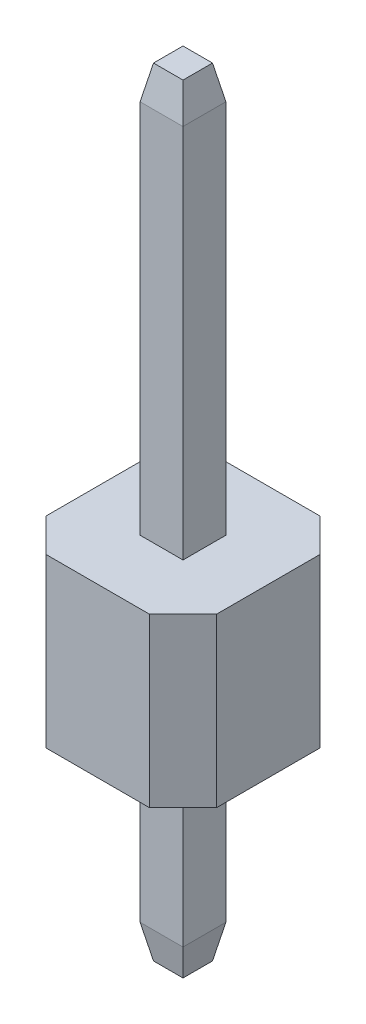
ISO-10303-21;
HEADER;
FILE_DESCRIPTION(('STEP AP214'),'2;1');
FILE_NAME('part.step','',(''),(''),'','','');
FILE_SCHEMA(('AUTOMOTIVE_DESIGN { 1 0 10303 214 1 1 1 1 }'));
ENDSEC;
DATA;
#1=APPLICATION_CONTEXT('core data for automotive mechanical design processes');
#2=APPLICATION_PROTOCOL_DEFINITION('international standard','automotive_design',2000,#1);
#3=PRODUCT_CONTEXT('',#1,'mechanical');
#4=PRODUCT('Part','Part','',(#3));
#5=PRODUCT_RELATED_PRODUCT_CATEGORY('part','',(#4));
#6=PRODUCT_DEFINITION_FORMATION('','',#4);
#7=PRODUCT_DEFINITION_CONTEXT('part definition',#1,'design');
#8=PRODUCT_DEFINITION('design','',#6,#7);
#9=PRODUCT_DEFINITION_SHAPE('','',#8);
#10=(LENGTH_UNIT() NAMED_UNIT(*) SI_UNIT(.MILLI.,.METRE.));
#11=(NAMED_UNIT(*) PLANE_ANGLE_UNIT() SI_UNIT($,.RADIAN.));
#12=(NAMED_UNIT(*) SI_UNIT($,.STERADIAN.) SOLID_ANGLE_UNIT());
#13=UNCERTAINTY_MEASURE_WITH_UNIT(LENGTH_MEASURE(1.E-05),#10,'distance_accuracy_value','');
#14=(GEOMETRIC_REPRESENTATION_CONTEXT(3) GLOBAL_UNCERTAINTY_ASSIGNED_CONTEXT((#13)) GLOBAL_UNIT_ASSIGNED_CONTEXT((#10,
#11,#12)) REPRESENTATION_CONTEXT('',''));
#15=CARTESIAN_POINT('',(0.,0.,0.));
#16=DIRECTION('',(0.,0.,1.));
#17=DIRECTION('',(1.,0.,0.));
#18=AXIS2_PLACEMENT_3D('',#15,#16,#17);
#19=CARTESIAN_POINT('',(-0.770000000000001,2.5,-1.27));
#20=DIRECTION('',(0.,0.,1.));
#21=DIRECTION('',(1.,0.,0.));
#22=AXIS2_PLACEMENT_3D('',#19,#20,#21);
#23=PLANE('',#22);
#24=DIRECTION('',(-1.,0.,0.));
#25=VECTOR('',#24,1.);
#26=CARTESIAN_POINT('',(-0.770000000000001,0.,-1.27));
#27=LINE('',#26,#25);
#28=CARTESIAN_POINT('',(0.769999999999999,0.,-1.27));
#29=VERTEX_POINT('',#28);
#30=CARTESIAN_POINT('',(-0.770000000000001,0.,-1.27));
#31=VERTEX_POINT('',#30);
#32=EDGE_CURVE('E155',#29,#31,#27,.T.);
#33=ORIENTED_EDGE('',*,*,#32,.T.);
#34=DIRECTION('',(0.,-1.,0.));
#35=VECTOR('',#34,1.);
#36=CARTESIAN_POINT('',(-0.770000000000001,2.5,-1.27));
#37=LINE('',#36,#35);
#38=CARTESIAN_POINT('',(-0.770000000000001,2.5,-1.27));
#39=VERTEX_POINT('',#38);
#40=EDGE_CURVE('E12',#39,#31,#37,.T.);
#41=ORIENTED_EDGE('',*,*,#40,.F.);
#42=DIRECTION('',(-1.,0.,0.));
#43=VECTOR('',#42,1.);
#44=CARTESIAN_POINT('',(-0.770000000000001,2.5,-1.27));
#45=LINE('',#44,#43);
#46=CARTESIAN_POINT('',(0.769999999999999,2.5,-1.27));
#47=VERTEX_POINT('',#46);
#48=EDGE_CURVE('E177',#47,#39,#45,.T.);
#49=ORIENTED_EDGE('',*,*,#48,.F.);
#50=DIRECTION('',(0.,-1.,0.));
#51=VECTOR('',#50,1.);
#52=CARTESIAN_POINT('',(0.769999999999999,2.5,-1.27));
#53=LINE('',#52,#51);
#54=EDGE_CURVE('E151',#47,#29,#53,.T.);
#55=ORIENTED_EDGE('',*,*,#54,.T.);
#56=EDGE_LOOP('',(#33,#41,#49,#55));
#57=FACE_BOUND('',#56,.T.);
#58=ADVANCED_FACE('F52',(#57),#23,.F.);
#59=CARTESIAN_POINT('',(-1.27,2.5,-0.769999999999999));
#60=DIRECTION('',(0.707106781186548,0.,0.707106781186548));
#61=DIRECTION('',(0.707106781186548,0.,-0.707106781186548));
#62=AXIS2_PLACEMENT_3D('',#59,#60,#61);
#63=PLANE('',#62);
#64=DIRECTION('',(-0.707106781186548,0.,0.707106781186548));
#65=VECTOR('',#64,1.);
#66=CARTESIAN_POINT('',(-1.27,0.,-0.769999999999999));
#67=LINE('',#66,#65);
#68=CARTESIAN_POINT('',(-1.27,0.,-0.769999999999999));
#69=VERTEX_POINT('',#68);
#70=EDGE_CURVE('E159',#31,#69,#67,.T.);
#71=ORIENTED_EDGE('',*,*,#70,.T.);
#72=DIRECTION('',(0.,-1.,0.));
#73=VECTOR('',#72,1.);
#74=CARTESIAN_POINT('',(-1.27,2.5,-0.769999999999999));
#75=LINE('',#74,#73);
#76=CARTESIAN_POINT('',(-1.27,2.5,-0.769999999999999));
#77=VERTEX_POINT('',#76);
#78=EDGE_CURVE('E61',#77,#69,#75,.T.);
#79=ORIENTED_EDGE('',*,*,#78,.F.);
#80=DIRECTION('',(-0.707106781186548,0.,0.707106781186548));
#81=VECTOR('',#80,1.);
#82=CARTESIAN_POINT('',(-1.27,2.5,-0.769999999999999));
#83=LINE('',#82,#81);
#84=EDGE_CURVE('E112',#39,#77,#83,.T.);
#85=ORIENTED_EDGE('',*,*,#84,.F.);
#86=ORIENTED_EDGE('',*,*,#40,.T.);
#87=EDGE_LOOP('',(#71,#79,#85,#86));
#88=FACE_BOUND('',#87,.T.);
#89=ADVANCED_FACE('F221',(#88),#63,.F.);
#90=CARTESIAN_POINT('',(-1.27,2.5,-0.769999999999999));
#91=DIRECTION('',(1.,0.,0.));
#92=DIRECTION('',(0.,0.,-1.));
#93=AXIS2_PLACEMENT_3D('',#90,#91,#92);
#94=PLANE('',#93);
#95=DIRECTION('',(0.,0.,1.));
#96=VECTOR('',#95,1.);
#97=CARTESIAN_POINT('',(-1.27,0.,-0.769999999999999));
#98=LINE('',#97,#96);
#99=CARTESIAN_POINT('',(-1.27,0.,0.770000000000001));
#100=VERTEX_POINT('',#99);
#101=EDGE_CURVE('E162',#69,#100,#98,.T.);
#102=ORIENTED_EDGE('',*,*,#101,.T.);
#103=DIRECTION('',(0.,-1.,0.));
#104=VECTOR('',#103,1.);
#105=CARTESIAN_POINT('',(-1.27,2.5,0.770000000000001));
#106=LINE('',#105,#104);
#107=CARTESIAN_POINT('',(-1.27,2.5,0.770000000000001));
#108=VERTEX_POINT('',#107);
#109=EDGE_CURVE('E188',#108,#100,#106,.T.);
#110=ORIENTED_EDGE('',*,*,#109,.F.);
#111=DIRECTION('',(0.,0.,1.));
#112=VECTOR('',#111,1.);
#113=CARTESIAN_POINT('',(-1.27,2.5,-0.769999999999999));
#114=LINE('',#113,#112);
#115=EDGE_CURVE('E198',#77,#108,#114,.T.);
#116=ORIENTED_EDGE('',*,*,#115,.F.);
#117=ORIENTED_EDGE('',*,*,#78,.T.);
#118=EDGE_LOOP('',(#102,#110,#116,#117));
#119=FACE_BOUND('',#118,.T.);
#120=ADVANCED_FACE('F196',(#119),#94,.F.);
#121=CARTESIAN_POINT('',(-1.27,2.5,0.770000000000001));
#122=DIRECTION('',(0.707106781186548,0.,-0.707106781186548));
#123=DIRECTION('',(-0.707106781186548,0.,-0.707106781186548));
#124=AXIS2_PLACEMENT_3D('',#121,#122,#123);
#125=PLANE('',#124);
#126=DIRECTION('',(0.707106781186548,0.,0.707106781186548));
#127=VECTOR('',#126,1.);
#128=CARTESIAN_POINT('',(-1.27,0.,0.770000000000001));
#129=LINE('',#128,#127);
#130=CARTESIAN_POINT('',(-0.77,0.,1.27));
#131=VERTEX_POINT('',#130);
#132=EDGE_CURVE('E165',#100,#131,#129,.T.);
#133=ORIENTED_EDGE('',*,*,#132,.T.);
#134=DIRECTION('',(0.,-1.,0.));
#135=VECTOR('',#134,1.);
#136=CARTESIAN_POINT('',(-0.77,2.5,1.27));
#137=LINE('',#136,#135);
#138=CARTESIAN_POINT('',(-0.77,2.5,1.27));
#139=VERTEX_POINT('',#138);
#140=EDGE_CURVE('E184',#139,#131,#137,.T.);
#141=ORIENTED_EDGE('',*,*,#140,.F.);
#142=DIRECTION('',(0.707106781186548,0.,0.707106781186548));
#143=VECTOR('',#142,1.);
#144=CARTESIAN_POINT('',(-1.27,2.5,0.770000000000001));
#145=LINE('',#144,#143);
#146=EDGE_CURVE('E211',#108,#139,#145,.T.);
#147=ORIENTED_EDGE('',*,*,#146,.F.);
#148=ORIENTED_EDGE('',*,*,#109,.T.);
#149=EDGE_LOOP('',(#133,#141,#147,#148));
#150=FACE_BOUND('',#149,.T.);
#151=ADVANCED_FACE('F206',(#150),#125,.F.);
#152=CARTESIAN_POINT('',(-0.77,2.5,1.27));
#153=DIRECTION('',(0.,0.,-1.));
#154=DIRECTION('',(-1.,0.,0.));
#155=AXIS2_PLACEMENT_3D('',#152,#153,#154);
#156=PLANE('',#155);
#157=DIRECTION('',(1.,0.,0.));
#158=VECTOR('',#157,1.);
#159=CARTESIAN_POINT('',(-0.77,0.,1.27));
#160=LINE('',#159,#158);
#161=CARTESIAN_POINT('',(0.77,0.,1.27));
#162=VERTEX_POINT('',#161);
#163=EDGE_CURVE('E168',#131,#162,#160,.T.);
#164=ORIENTED_EDGE('',*,*,#163,.T.);
#165=DIRECTION('',(0.,-1.,0.));
#166=VECTOR('',#165,1.);
#167=CARTESIAN_POINT('',(0.77,2.5,1.27));
#168=LINE('',#167,#166);
#169=CARTESIAN_POINT('',(0.77,2.5,1.27));
#170=VERTEX_POINT('',#169);
#171=EDGE_CURVE('E142',#170,#162,#168,.T.);
#172=ORIENTED_EDGE('',*,*,#171,.F.);
#173=DIRECTION('',(1.,0.,0.));
#174=VECTOR('',#173,1.);
#175=CARTESIAN_POINT('',(-0.77,2.5,1.27));
#176=LINE('',#175,#174);
#177=EDGE_CURVE('E131',#139,#170,#176,.T.);
#178=ORIENTED_EDGE('',*,*,#177,.F.);
#179=ORIENTED_EDGE('',*,*,#140,.T.);
#180=EDGE_LOOP('',(#164,#172,#178,#179));
#181=FACE_BOUND('',#180,.T.);
#182=ADVANCED_FACE('F209',(#181),#156,.F.);
#183=CARTESIAN_POINT('',(0.77,2.5,1.27));
#184=DIRECTION('',(-0.707106781186548,0.,-0.707106781186548));
#185=DIRECTION('',(-0.707106781186548,0.,0.707106781186548));
#186=AXIS2_PLACEMENT_3D('',#183,#184,#185);
#187=PLANE('',#186);
#188=DIRECTION('',(0.707106781186548,0.,-0.707106781186548));
#189=VECTOR('',#188,1.);
#190=CARTESIAN_POINT('',(0.77,0.,1.27));
#191=LINE('',#190,#189);
#192=CARTESIAN_POINT('',(1.27,0.,0.770000000000001));
#193=VERTEX_POINT('',#192);
#194=EDGE_CURVE('E140',#162,#193,#191,.T.);
#195=ORIENTED_EDGE('',*,*,#194,.T.);
#196=DIRECTION('',(0.,-1.,0.));
#197=VECTOR('',#196,1.);
#198=CARTESIAN_POINT('',(1.27,2.5,0.770000000000001));
#199=LINE('',#198,#197);
#200=CARTESIAN_POINT('',(1.27,2.5,0.770000000000001));
#201=VERTEX_POINT('',#200);
#202=EDGE_CURVE('E137',#201,#193,#199,.T.);
#203=ORIENTED_EDGE('',*,*,#202,.F.);
#204=DIRECTION('',(0.707106781186548,0.,-0.707106781186548));
#205=VECTOR('',#204,1.);
#206=CARTESIAN_POINT('',(0.77,2.5,1.27));
#207=LINE('',#206,#205);
#208=EDGE_CURVE('E125',#170,#201,#207,.T.);
#209=ORIENTED_EDGE('',*,*,#208,.F.);
#210=ORIENTED_EDGE('',*,*,#171,.T.);
#211=EDGE_LOOP('',(#195,#203,#209,#210));
#212=FACE_BOUND('',#211,.T.);
#213=ADVANCED_FACE('F138',(#212),#187,.F.);
#214=CARTESIAN_POINT('',(1.27,2.5,-0.769999999999999));
#215=DIRECTION('',(-1.,0.,0.));
#216=DIRECTION('',(0.,0.,1.));
#217=AXIS2_PLACEMENT_3D('',#214,#215,#216);
#218=PLANE('',#217);
#219=DIRECTION('',(0.,0.,-1.));
#220=VECTOR('',#219,1.);
#221=CARTESIAN_POINT('',(1.27,0.,-0.769999999999999));
#222=LINE('',#221,#220);
#223=CARTESIAN_POINT('',(1.27,0.,-0.769999999999999));
#224=VERTEX_POINT('',#223);
#225=EDGE_CURVE('E98',#193,#224,#222,.T.);
#226=ORIENTED_EDGE('',*,*,#225,.T.);
#227=DIRECTION('',(0.,-1.,0.));
#228=VECTOR('',#227,1.);
#229=CARTESIAN_POINT('',(1.27,2.5,-0.769999999999999));
#230=LINE('',#229,#228);
#231=CARTESIAN_POINT('',(1.27,2.5,-0.769999999999999));
#232=VERTEX_POINT('',#231);
#233=EDGE_CURVE('E143',#232,#224,#230,.T.);
#234=ORIENTED_EDGE('',*,*,#233,.F.);
#235=DIRECTION('',(0.,0.,-1.));
#236=VECTOR('',#235,1.);
#237=CARTESIAN_POINT('',(1.27,2.5,-0.769999999999999));
#238=LINE('',#237,#236);
#239=EDGE_CURVE('E129',#201,#232,#238,.T.);
#240=ORIENTED_EDGE('',*,*,#239,.F.);
#241=ORIENTED_EDGE('',*,*,#202,.T.);
#242=EDGE_LOOP('',(#226,#234,#240,#241));
#243=FACE_BOUND('',#242,.T.);
#244=ADVANCED_FACE('F145',(#243),#218,.F.);
#245=CARTESIAN_POINT('',(0.769999999999999,2.5,-1.27));
#246=DIRECTION('',(-0.707106781186548,0.,0.707106781186548));
#247=DIRECTION('',(0.707106781186548,0.,0.707106781186548));
#248=AXIS2_PLACEMENT_3D('',#245,#246,#247);
#249=PLANE('',#248);
#250=DIRECTION('',(-0.707106781186548,0.,-0.707106781186548));
#251=VECTOR('',#250,1.);
#252=CARTESIAN_POINT('',(0.769999999999999,0.,-1.27));
#253=LINE('',#252,#251);
#254=EDGE_CURVE('E104',#224,#29,#253,.T.);
#255=ORIENTED_EDGE('',*,*,#254,.T.);
#256=ORIENTED_EDGE('',*,*,#54,.F.);
#257=DIRECTION('',(-0.707106781186548,0.,-0.707106781186548));
#258=VECTOR('',#257,1.);
#259=CARTESIAN_POINT('',(0.769999999999999,2.5,-1.27));
#260=LINE('',#259,#258);
#261=EDGE_CURVE('E69',#232,#47,#260,.T.);
#262=ORIENTED_EDGE('',*,*,#261,.F.);
#263=ORIENTED_EDGE('',*,*,#233,.T.);
#264=EDGE_LOOP('',(#255,#256,#262,#263));
#265=FACE_BOUND('',#264,.T.);
#266=ADVANCED_FACE('F237',(#265),#249,.F.);
#267=CARTESIAN_POINT('',(0.,2.5,0.));
#268=DIRECTION('',(0.,-1.,0.));
#269=DIRECTION('',(0.,0.,-1.));
#270=AXIS2_PLACEMENT_3D('',#267,#268,#269);
#271=PLANE('',#270);
#272=ORIENTED_EDGE('',*,*,#48,.T.);
#273=ORIENTED_EDGE('',*,*,#84,.T.);
#274=ORIENTED_EDGE('',*,*,#115,.T.);
#275=ORIENTED_EDGE('',*,*,#146,.T.);
#276=ORIENTED_EDGE('',*,*,#177,.T.);
#277=ORIENTED_EDGE('',*,*,#208,.T.);
#278=ORIENTED_EDGE('',*,*,#239,.T.);
#279=ORIENTED_EDGE('',*,*,#261,.T.);
#280=EDGE_LOOP('',(#272,#273,#274,#275,#276,#277,#278,#279));
#281=FACE_BOUND('',#280,.T.);
#282=ADVANCED_FACE('F127',(#281),#271,.F.);
#283=CARTESIAN_POINT('',(0.,0.,0.));
#284=DIRECTION('',(0.,-1.,0.));
#285=DIRECTION('',(0.,0.,-1.));
#286=AXIS2_PLACEMENT_3D('',#283,#284,#285);
#287=PLANE('',#286);
#288=ORIENTED_EDGE('',*,*,#32,.F.);
#289=ORIENTED_EDGE('',*,*,#254,.F.);
#290=ORIENTED_EDGE('',*,*,#225,.F.);
#291=ORIENTED_EDGE('',*,*,#194,.F.);
#292=ORIENTED_EDGE('',*,*,#163,.F.);
#293=ORIENTED_EDGE('',*,*,#132,.F.);
#294=ORIENTED_EDGE('',*,*,#101,.F.);
#295=ORIENTED_EDGE('',*,*,#70,.F.);
#296=EDGE_LOOP('',(#288,#289,#290,#291,#292,#293,#294,#295));
#297=FACE_BOUND('',#296,.T.);
#298=ADVANCED_FACE('F202',(#297),#287,.T.);
#299=CLOSED_SHELL('',(#58,#89,#120,#151,#182,#213,#244,#266,#282,#298));
#300=MANIFOLD_SOLID_BREP('B2',#299);
#301=CARTESIAN_POINT('',(0.32,8.6,-0.32));
#302=DIRECTION('',(-1.,0.,0.));
#303=DIRECTION('',(0.,0.,1.));
#304=AXIS2_PLACEMENT_3D('',#301,#302,#303);
#305=PLANE('',#304);
#306=DIRECTION('',(0.,-1.,0.));
#307=VECTOR('',#306,1.);
#308=CARTESIAN_POINT('',(0.32,8.6,0.32));
#309=LINE('',#308,#307);
#310=CARTESIAN_POINT('',(0.32,8.09999999999999,0.32));
#311=VERTEX_POINT('',#310);
#312=CARTESIAN_POINT('',(0.32,-2.49999999999999,0.32));
#313=VERTEX_POINT('',#312);
#314=EDGE_CURVE('E437',#311,#313,#309,.T.);
#315=ORIENTED_EDGE('',*,*,#314,.T.);
#316=DIRECTION('',(0.,0.,-1.));
#317=VECTOR('',#316,1.);
#318=CARTESIAN_POINT('',(0.32,-2.49999999999999,-0.32));
#319=LINE('',#318,#317);
#320=CARTESIAN_POINT('',(0.32,-2.49999999999999,-0.32));
#321=VERTEX_POINT('',#320);
#322=EDGE_CURVE('E50',#313,#321,#319,.T.);
#323=ORIENTED_EDGE('',*,*,#322,.T.);
#324=DIRECTION('',(0.,-1.,0.));
#325=VECTOR('',#324,1.);
#326=CARTESIAN_POINT('',(0.32,8.6,-0.32));
#327=LINE('',#326,#325);
#328=CARTESIAN_POINT('',(0.32,8.09999999999999,-0.32));
#329=VERTEX_POINT('',#328);
#330=EDGE_CURVE('E404',#329,#321,#327,.T.);
#331=ORIENTED_EDGE('',*,*,#330,.F.);
#332=DIRECTION('',(0.,0.,1.));
#333=VECTOR('',#332,1.);
#334=CARTESIAN_POINT('',(0.32,8.09999999999999,0.32));
#335=LINE('',#334,#333);
#336=EDGE_CURVE('E426',#329,#311,#335,.T.);
#337=ORIENTED_EDGE('',*,*,#336,.T.);
#338=EDGE_LOOP('',(#315,#323,#331,#337));
#339=FACE_BOUND('',#338,.T.);
#340=ADVANCED_FACE('F313',(#339),#305,.F.);
#341=CARTESIAN_POINT('',(-0.32,8.6,-0.32));
#342=DIRECTION('',(0.,0.,1.));
#343=DIRECTION('',(1.,0.,0.));
#344=AXIS2_PLACEMENT_3D('',#341,#342,#343);
#345=PLANE('',#344);
#346=ORIENTED_EDGE('',*,*,#330,.T.);
#347=DIRECTION('',(-1.,0.,0.));
#348=VECTOR('',#347,1.);
#349=CARTESIAN_POINT('',(-0.32,-2.49999999999999,-0.32));
#350=LINE('',#349,#348);
#351=CARTESIAN_POINT('',(-0.32,-2.49999999999999,-0.32));
#352=VERTEX_POINT('',#351);
#353=EDGE_CURVE('E427',#321,#352,#350,.T.);
#354=ORIENTED_EDGE('',*,*,#353,.T.);
#355=DIRECTION('',(0.,-1.,0.));
#356=VECTOR('',#355,1.);
#357=CARTESIAN_POINT('',(-0.32,8.6,-0.32));
#358=LINE('',#357,#356);
#359=CARTESIAN_POINT('',(-0.32,8.09999999999999,-0.32));
#360=VERTEX_POINT('',#359);
#361=EDGE_CURVE('E490',#360,#352,#358,.T.);
#362=ORIENTED_EDGE('',*,*,#361,.F.);
#363=DIRECTION('',(1.,0.,0.));
#364=VECTOR('',#363,1.);
#365=CARTESIAN_POINT('',(0.32,8.09999999999999,-0.32));
#366=LINE('',#365,#364);
#367=EDGE_CURVE('E423',#360,#329,#366,.T.);
#368=ORIENTED_EDGE('',*,*,#367,.T.);
#369=EDGE_LOOP('',(#346,#354,#362,#368));
#370=FACE_BOUND('',#369,.T.);
#371=ADVANCED_FACE('F489',(#370),#345,.F.);
#372=CARTESIAN_POINT('',(-0.32,8.6,-0.32));
#373=DIRECTION('',(1.,0.,0.));
#374=DIRECTION('',(0.,0.,-1.));
#375=AXIS2_PLACEMENT_3D('',#372,#373,#374);
#376=PLANE('',#375);
#377=ORIENTED_EDGE('',*,*,#361,.T.);
#378=DIRECTION('',(0.,0.,1.));
#379=VECTOR('',#378,1.);
#380=CARTESIAN_POINT('',(-0.32,-2.49999999999999,-0.32));
#381=LINE('',#380,#379);
#382=CARTESIAN_POINT('',(-0.32,-2.49999999999999,0.32));
#383=VERTEX_POINT('',#382);
#384=EDGE_CURVE('E338',#352,#383,#381,.T.);
#385=ORIENTED_EDGE('',*,*,#384,.T.);
#386=DIRECTION('',(0.,-1.,0.));
#387=VECTOR('',#386,1.);
#388=CARTESIAN_POINT('',(-0.32,8.6,0.32));
#389=LINE('',#388,#387);
#390=CARTESIAN_POINT('',(-0.32,8.09999999999999,0.32));
#391=VERTEX_POINT('',#390);
#392=EDGE_CURVE('E496',#391,#383,#389,.T.);
#393=ORIENTED_EDGE('',*,*,#392,.F.);
#394=DIRECTION('',(0.,0.,-1.));
#395=VECTOR('',#394,1.);
#396=CARTESIAN_POINT('',(-0.32,8.09999999999999,-0.32));
#397=LINE('',#396,#395);
#398=EDGE_CURVE('E415',#391,#360,#397,.T.);
#399=ORIENTED_EDGE('',*,*,#398,.T.);
#400=EDGE_LOOP('',(#377,#385,#393,#399));
#401=FACE_BOUND('',#400,.T.);
#402=ADVANCED_FACE('F493',(#401),#376,.F.);
#403=CARTESIAN_POINT('',(-0.32,8.6,0.32));
#404=DIRECTION('',(0.,0.,-1.));
#405=DIRECTION('',(-1.,0.,0.));
#406=AXIS2_PLACEMENT_3D('',#403,#404,#405);
#407=PLANE('',#406);
#408=ORIENTED_EDGE('',*,*,#392,.T.);
#409=DIRECTION('',(1.,0.,0.));
#410=VECTOR('',#409,1.);
#411=CARTESIAN_POINT('',(-0.32,-2.49999999999999,0.32));
#412=LINE('',#411,#410);
#413=EDGE_CURVE('E323',#383,#313,#412,.T.);
#414=ORIENTED_EDGE('',*,*,#413,.T.);
#415=ORIENTED_EDGE('',*,*,#314,.F.);
#416=DIRECTION('',(-1.,0.,0.));
#417=VECTOR('',#416,1.);
#418=CARTESIAN_POINT('',(-0.32,8.09999999999999,0.32));
#419=LINE('',#418,#417);
#420=EDGE_CURVE('E389',#311,#391,#419,.T.);
#421=ORIENTED_EDGE('',*,*,#420,.T.);
#422=EDGE_LOOP('',(#408,#414,#415,#421));
#423=FACE_BOUND('',#422,.T.);
#424=ADVANCED_FACE('F510',(#423),#407,.F.);
#425=CARTESIAN_POINT('',(0.,8.6,0.));
#426=DIRECTION('',(0.,1.,0.));
#427=DIRECTION('',(0.,0.,1.));
#428=AXIS2_PLACEMENT_3D('',#425,#426,#427);
#429=PLANE('',#428);
#430=DIRECTION('',(0.,0.,1.));
#431=VECTOR('',#430,1.);
#432=CARTESIAN_POINT('',(-0.22,8.6,0.32));
#433=LINE('',#432,#431);
#434=CARTESIAN_POINT('',(-0.22,8.6,-0.22));
#435=VERTEX_POINT('',#434);
#436=CARTESIAN_POINT('',(-0.22,8.6,0.22));
#437=VERTEX_POINT('',#436);
#438=EDGE_CURVE('E408',#435,#437,#433,.T.);
#439=ORIENTED_EDGE('',*,*,#438,.T.);
#440=DIRECTION('',(1.,0.,0.));
#441=VECTOR('',#440,1.);
#442=CARTESIAN_POINT('',(0.32,8.6,0.22));
#443=LINE('',#442,#441);
#444=CARTESIAN_POINT('',(0.22,8.6,0.22));
#445=VERTEX_POINT('',#444);
#446=EDGE_CURVE('E387',#437,#445,#443,.T.);
#447=ORIENTED_EDGE('',*,*,#446,.T.);
#448=DIRECTION('',(0.,0.,-1.));
#449=VECTOR('',#448,1.);
#450=CARTESIAN_POINT('',(0.22,8.6,-0.32));
#451=LINE('',#450,#449);
#452=CARTESIAN_POINT('',(0.22,8.6,-0.22));
#453=VERTEX_POINT('',#452);
#454=EDGE_CURVE('E396',#445,#453,#451,.T.);
#455=ORIENTED_EDGE('',*,*,#454,.T.);
#456=DIRECTION('',(-1.,0.,0.));
#457=VECTOR('',#456,1.);
#458=CARTESIAN_POINT('',(-0.32,8.6,-0.22));
#459=LINE('',#458,#457);
#460=EDGE_CURVE('E403',#453,#435,#459,.T.);
#461=ORIENTED_EDGE('',*,*,#460,.T.);
#462=EDGE_LOOP('',(#439,#447,#455,#461));
#463=FACE_BOUND('',#462,.T.);
#464=ADVANCED_FACE('F406',(#463),#429,.T.);
#465=CARTESIAN_POINT('',(0.,-3.,0.));
#466=DIRECTION('',(0.,1.,0.));
#467=DIRECTION('',(0.,0.,1.));
#468=AXIS2_PLACEMENT_3D('',#465,#466,#467);
#469=PLANE('',#468);
#470=DIRECTION('',(0.,0.,-1.));
#471=VECTOR('',#470,1.);
#472=CARTESIAN_POINT('',(-0.22,-3.,0.));
#473=LINE('',#472,#471);
#474=CARTESIAN_POINT('',(-0.22,-3.,0.22));
#475=VERTEX_POINT('',#474);
#476=CARTESIAN_POINT('',(-0.22,-3.,-0.22));
#477=VERTEX_POINT('',#476);
#478=EDGE_CURVE('E447',#475,#477,#473,.T.);
#479=ORIENTED_EDGE('',*,*,#478,.T.);
#480=DIRECTION('',(1.,0.,0.));
#481=VECTOR('',#480,1.);
#482=CARTESIAN_POINT('',(0.,-3.,-0.22));
#483=LINE('',#482,#481);
#484=CARTESIAN_POINT('',(0.22,-3.,-0.22));
#485=VERTEX_POINT('',#484);
#486=EDGE_CURVE('E450',#477,#485,#483,.T.);
#487=ORIENTED_EDGE('',*,*,#486,.T.);
#488=DIRECTION('',(0.,0.,1.));
#489=VECTOR('',#488,1.);
#490=CARTESIAN_POINT('',(0.22,-3.,0.));
#491=LINE('',#490,#489);
#492=CARTESIAN_POINT('',(0.22,-3.,0.22));
#493=VERTEX_POINT('',#492);
#494=EDGE_CURVE('E441',#485,#493,#491,.T.);
#495=ORIENTED_EDGE('',*,*,#494,.T.);
#496=DIRECTION('',(-1.,0.,0.));
#497=VECTOR('',#496,1.);
#498=CARTESIAN_POINT('',(0.,-3.,0.22));
#499=LINE('',#498,#497);
#500=EDGE_CURVE('E444',#493,#475,#499,.T.);
#501=ORIENTED_EDGE('',*,*,#500,.T.);
#502=EDGE_LOOP('',(#479,#487,#495,#501));
#503=FACE_BOUND('',#502,.T.);
#504=ADVANCED_FACE('F479',(#503),#469,.F.);
#505=CARTESIAN_POINT('',(0.,8.6,-0.22));
#506=DIRECTION('',(0.,0.196116135138181,-0.980580675690921));
#507=DIRECTION('',(1.,0.,0.));
#508=AXIS2_PLACEMENT_3D('',#505,#506,#507);
#509=PLANE('',#508);
#510=DIRECTION('',(-0.192450089729872,0.962250448649377,0.192450089729872));
#511=VECTOR('',#510,1.);
#512=CARTESIAN_POINT('',(0.211851851851852,8.64074074074074,-0.211851851851852));
#513=LINE('',#512,#511);
#514=EDGE_CURVE('E399',#329,#453,#513,.T.);
#515=ORIENTED_EDGE('',*,*,#514,.F.);
#516=ORIENTED_EDGE('',*,*,#367,.F.);
#517=DIRECTION('',(0.192450089729873,0.962250448649377,0.192450089729872));
#518=VECTOR('',#517,1.);
#519=CARTESIAN_POINT('',(-0.211851851851852,8.64074074074074,-0.211851851851852));
#520=LINE('',#519,#518);
#521=EDGE_CURVE('E433',#435,#360,#520,.F.);
#522=ORIENTED_EDGE('',*,*,#521,.F.);
#523=ORIENTED_EDGE('',*,*,#460,.F.);
#524=EDGE_LOOP('',(#515,#516,#522,#523));
#525=FACE_BOUND('',#524,.T.);
#526=ADVANCED_FACE('F507',(#525),#509,.T.);
#527=CARTESIAN_POINT('',(-0.22,8.6,0.));
#528=DIRECTION('',(-0.980580675690921,0.196116135138181,0.));
#529=DIRECTION('',(0.,0.,-1.));
#530=AXIS2_PLACEMENT_3D('',#527,#528,#529);
#531=PLANE('',#530);
#532=ORIENTED_EDGE('',*,*,#521,.T.);
#533=ORIENTED_EDGE('',*,*,#398,.F.);
#534=DIRECTION('',(0.192450089729872,0.962250448649377,-0.192450089729872));
#535=VECTOR('',#534,1.);
#536=CARTESIAN_POINT('',(-0.211851851851852,8.64074074074074,0.211851851851852));
#537=LINE('',#536,#535);
#538=EDGE_CURVE('E393',#437,#391,#537,.F.);
#539=ORIENTED_EDGE('',*,*,#538,.F.);
#540=ORIENTED_EDGE('',*,*,#438,.F.);
#541=EDGE_LOOP('',(#532,#533,#539,#540));
#542=FACE_BOUND('',#541,.T.);
#543=ADVANCED_FACE('F509',(#542),#531,.T.);
#544=CARTESIAN_POINT('',(0.22,8.6,0.));
#545=DIRECTION('',(0.980580675690921,0.196116135138181,0.));
#546=DIRECTION('',(0.,0.,1.));
#547=AXIS2_PLACEMENT_3D('',#544,#545,#546);
#548=PLANE('',#547);
#549=ORIENTED_EDGE('',*,*,#514,.T.);
#550=ORIENTED_EDGE('',*,*,#454,.F.);
#551=DIRECTION('',(0.192450089729873,-0.962250448649377,0.192450089729872));
#552=VECTOR('',#551,1.);
#553=CARTESIAN_POINT('',(0.211851851851852,8.64074074074074,0.211851851851852));
#554=LINE('',#553,#552);
#555=EDGE_CURVE('E383',#311,#445,#554,.F.);
#556=ORIENTED_EDGE('',*,*,#555,.F.);
#557=ORIENTED_EDGE('',*,*,#336,.F.);
#558=EDGE_LOOP('',(#549,#550,#556,#557));
#559=FACE_BOUND('',#558,.T.);
#560=ADVANCED_FACE('F397',(#559),#548,.T.);
#561=CARTESIAN_POINT('',(0.,8.6,0.22));
#562=DIRECTION('',(0.,0.196116135138181,0.980580675690921));
#563=DIRECTION('',(-1.,0.,0.));
#564=AXIS2_PLACEMENT_3D('',#561,#562,#563);
#565=PLANE('',#564);
#566=ORIENTED_EDGE('',*,*,#538,.T.);
#567=ORIENTED_EDGE('',*,*,#420,.F.);
#568=ORIENTED_EDGE('',*,*,#555,.T.);
#569=ORIENTED_EDGE('',*,*,#446,.F.);
#570=EDGE_LOOP('',(#566,#567,#568,#569));
#571=FACE_BOUND('',#570,.T.);
#572=ADVANCED_FACE('F385',(#571),#565,.T.);
#573=CARTESIAN_POINT('',(-0.32,-2.49999999999999,0.32));
#574=DIRECTION('',(0.,0.196116135138181,-0.980580675690921));
#575=DIRECTION('',(1.,0.,0.));
#576=AXIS2_PLACEMENT_3D('',#573,#574,#575);
#577=PLANE('',#576);
#578=DIRECTION('',(0.192450089729872,-0.962250448649378,-0.192450089729872));
#579=VECTOR('',#578,1.);
#580=CARTESIAN_POINT('',(-0.32,-2.49999999999999,0.32));
#581=LINE('',#580,#579);
#582=EDGE_CURVE('E462',#475,#383,#581,.F.);
#583=ORIENTED_EDGE('',*,*,#582,.F.);
#584=ORIENTED_EDGE('',*,*,#500,.F.);
#585=DIRECTION('',(-0.192450089729872,-0.962250448649378,-0.192450089729872));
#586=VECTOR('',#585,1.);
#587=CARTESIAN_POINT('',(0.296296296296297,-2.61851851851851,0.296296296296297));
#588=LINE('',#587,#586);
#589=EDGE_CURVE('E317',#313,#493,#588,.T.);
#590=ORIENTED_EDGE('',*,*,#589,.F.);
#591=ORIENTED_EDGE('',*,*,#413,.F.);
#592=EDGE_LOOP('',(#583,#584,#590,#591));
#593=FACE_BOUND('',#592,.T.);
#594=ADVANCED_FACE('F315',(#593),#577,.F.);
#595=CARTESIAN_POINT('',(0.32,-2.49999999999999,-0.32));
#596=DIRECTION('',(-0.980580675690921,0.196116135138181,0.));
#597=DIRECTION('',(0.,0.,-1.));
#598=AXIS2_PLACEMENT_3D('',#595,#596,#597);
#599=PLANE('',#598);
#600=ORIENTED_EDGE('',*,*,#589,.T.);
#601=ORIENTED_EDGE('',*,*,#494,.F.);
#602=DIRECTION('',(0.192450089729872,0.962250448649378,-0.192450089729872));
#603=VECTOR('',#602,1.);
#604=CARTESIAN_POINT('',(0.32,-2.49999999999999,-0.32));
#605=LINE('',#604,#603);
#606=EDGE_CURVE('E460',#321,#485,#605,.F.);
#607=ORIENTED_EDGE('',*,*,#606,.F.);
#608=ORIENTED_EDGE('',*,*,#322,.F.);
#609=EDGE_LOOP('',(#600,#601,#607,#608));
#610=FACE_BOUND('',#609,.T.);
#611=ADVANCED_FACE('F474',(#610),#599,.F.);
#612=CARTESIAN_POINT('',(-0.32,-2.49999999999999,-0.32));
#613=DIRECTION('',(0.980580675690921,0.196116135138181,0.));
#614=DIRECTION('',(0.,0.,1.));
#615=AXIS2_PLACEMENT_3D('',#612,#613,#614);
#616=PLANE('',#615);
#617=ORIENTED_EDGE('',*,*,#582,.T.);
#618=ORIENTED_EDGE('',*,*,#384,.F.);
#619=DIRECTION('',(0.192450089729872,-0.962250448649378,0.192450089729872));
#620=VECTOR('',#619,1.);
#621=CARTESIAN_POINT('',(-0.32,-2.49999999999999,-0.32));
#622=LINE('',#621,#620);
#623=EDGE_CURVE('E457',#477,#352,#622,.F.);
#624=ORIENTED_EDGE('',*,*,#623,.F.);
#625=ORIENTED_EDGE('',*,*,#478,.F.);
#626=EDGE_LOOP('',(#617,#618,#624,#625));
#627=FACE_BOUND('',#626,.T.);
#628=ADVANCED_FACE('F485',(#627),#616,.F.);
#629=CARTESIAN_POINT('',(-0.32,-2.49999999999999,-0.32));
#630=DIRECTION('',(0.,0.196116135138181,0.980580675690921));
#631=DIRECTION('',(-1.,0.,0.));
#632=AXIS2_PLACEMENT_3D('',#629,#630,#631);
#633=PLANE('',#632);
#634=ORIENTED_EDGE('',*,*,#606,.T.);
#635=ORIENTED_EDGE('',*,*,#486,.F.);
#636=ORIENTED_EDGE('',*,*,#623,.T.);
#637=ORIENTED_EDGE('',*,*,#353,.F.);
#638=EDGE_LOOP('',(#634,#635,#636,#637));
#639=FACE_BOUND('',#638,.T.);
#640=ADVANCED_FACE('F483',(#639),#633,.F.);
#641=CLOSED_SHELL('',(#340,#371,#402,#424,#464,#504,#526,#543,#560,#572,#594,#611,#628,#640));
#642=MANIFOLD_SOLID_BREP('B6',#641);
#643=ADVANCED_BREP_SHAPE_REPRESENTATION('',(#18,#300,#642),#14);
#644=SHAPE_DEFINITION_REPRESENTATION(#9,#643);
ENDSEC;
END-ISO-10303-21;
